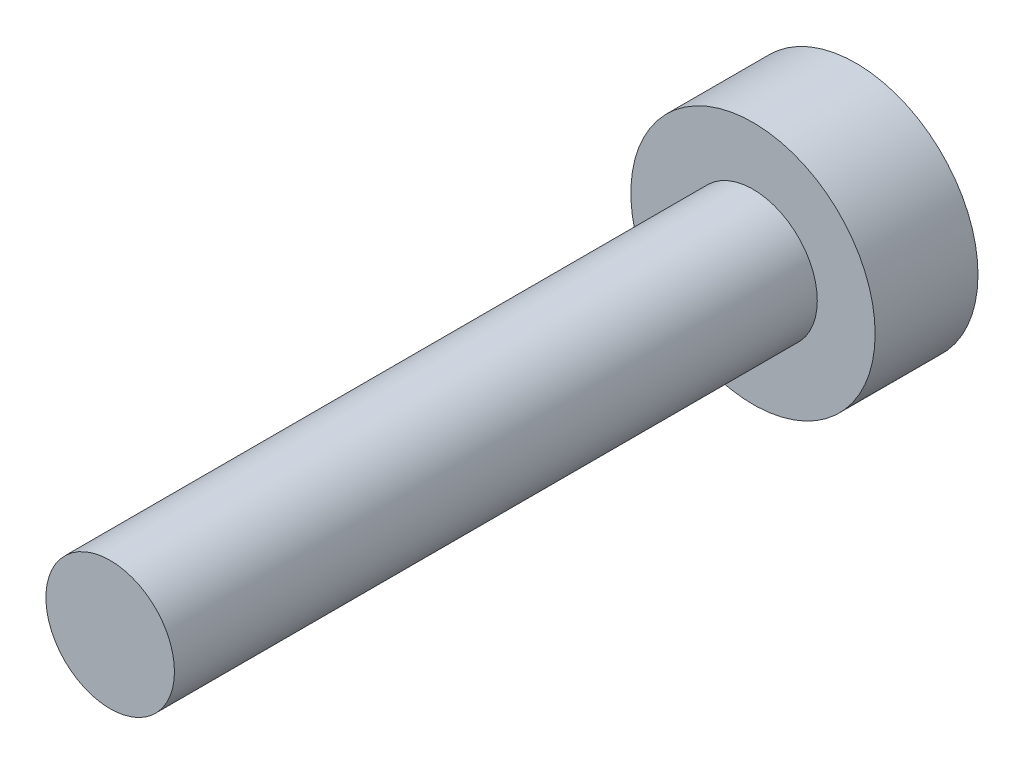
ISO-10303-21;
HEADER;
FILE_DESCRIPTION(('STEP AP214'),'2;1');
FILE_NAME('part.step','',(''),(''),'','','');
FILE_SCHEMA(('AUTOMOTIVE_DESIGN { 1 0 10303 214 1 1 1 1 }'));
ENDSEC;
DATA;
#1=APPLICATION_CONTEXT('core data for automotive mechanical design processes');
#2=APPLICATION_PROTOCOL_DEFINITION('international standard','automotive_design',2000,#1);
#3=PRODUCT_CONTEXT('',#1,'mechanical');
#4=PRODUCT('Part','Part','',(#3));
#5=PRODUCT_RELATED_PRODUCT_CATEGORY('part','',(#4));
#6=PRODUCT_DEFINITION_FORMATION('','',#4);
#7=PRODUCT_DEFINITION_CONTEXT('part definition',#1,'design');
#8=PRODUCT_DEFINITION('design','',#6,#7);
#9=PRODUCT_DEFINITION_SHAPE('','',#8);
#10=(LENGTH_UNIT() NAMED_UNIT(*) SI_UNIT(.MILLI.,.METRE.));
#11=(NAMED_UNIT(*) PLANE_ANGLE_UNIT() SI_UNIT($,.RADIAN.));
#12=(NAMED_UNIT(*) SI_UNIT($,.STERADIAN.) SOLID_ANGLE_UNIT());
#13=UNCERTAINTY_MEASURE_WITH_UNIT(LENGTH_MEASURE(1.E-05),#10,'distance_accuracy_value','');
#14=(GEOMETRIC_REPRESENTATION_CONTEXT(3) GLOBAL_UNCERTAINTY_ASSIGNED_CONTEXT((#13)) GLOBAL_UNIT_ASSIGNED_CONTEXT((#10,
#11,#12)) REPRESENTATION_CONTEXT('',''));
#15=CARTESIAN_POINT('',(0.,0.,0.));
#16=DIRECTION('',(0.,0.,1.));
#17=DIRECTION('',(1.,0.,0.));
#18=AXIS2_PLACEMENT_3D('',#15,#16,#17);
#19=CARTESIAN_POINT('',(0.,0.,10.));
#20=DIRECTION('',(0.,0.,-1.));
#21=DIRECTION('',(-1.,0.,0.));
#22=AXIS2_PLACEMENT_3D('',#19,#20,#21);
#23=CYLINDRICAL_SURFACE('',#22,1.);
#24=CARTESIAN_POINT('',(0.,0.,10.));
#25=DIRECTION('',(0.,0.,1.));
#26=DIRECTION('',(1.,0.,0.));
#27=AXIS2_PLACEMENT_3D('',#24,#25,#26);
#28=CIRCLE('',#27,1.);
#29=CARTESIAN_POINT('',(1.,0.,10.));
#30=VERTEX_POINT('',#29);
#31=EDGE_CURVE('E10',#30,#30,#28,.T.);
#32=ORIENTED_EDGE('',*,*,#31,.F.);
#33=EDGE_LOOP('',(#32));
#34=FACE_BOUND('',#33,.T.);
#35=CARTESIAN_POINT('',(0.,0.,0.));
#36=DIRECTION('',(0.,0.,1.));
#37=DIRECTION('',(1.,0.,0.));
#38=AXIS2_PLACEMENT_3D('',#35,#36,#37);
#39=CIRCLE('',#38,1.);
#40=CARTESIAN_POINT('',(1.,0.,0.));
#41=VERTEX_POINT('',#40);
#42=EDGE_CURVE('E36',#41,#41,#39,.T.);
#43=ORIENTED_EDGE('',*,*,#42,.T.);
#44=EDGE_LOOP('',(#43));
#45=FACE_BOUND('',#44,.T.);
#46=ADVANCED_FACE('F33',(#34,#45),#23,.T.);
#47=CARTESIAN_POINT('',(0.,0.,10.));
#48=DIRECTION('',(0.,0.,1.));
#49=DIRECTION('',(1.,0.,0.));
#50=AXIS2_PLACEMENT_3D('',#47,#48,#49);
#51=PLANE('',#50);
#52=ORIENTED_EDGE('',*,*,#31,.T.);
#53=EDGE_LOOP('',(#52));
#54=FACE_BOUND('',#53,.T.);
#55=ADVANCED_FACE('F56',(#54),#51,.T.);
#56=CARTESIAN_POINT('',(0.,0.,0.));
#57=DIRECTION('',(0.,0.,-1.));
#58=DIRECTION('',(-1.,0.,0.));
#59=AXIS2_PLACEMENT_3D('',#56,#57,#58);
#60=CYLINDRICAL_SURFACE('',#59,1.9);
#61=CARTESIAN_POINT('',(0.,0.,0.));
#62=DIRECTION('',(0.,0.,1.));
#63=DIRECTION('',(1.,0.,0.));
#64=AXIS2_PLACEMENT_3D('',#61,#62,#63);
#65=CIRCLE('',#64,1.9);
#66=CARTESIAN_POINT('',(1.9,0.,0.));
#67=VERTEX_POINT('',#66);
#68=EDGE_CURVE('E43',#67,#67,#65,.T.);
#69=ORIENTED_EDGE('',*,*,#68,.F.);
#70=EDGE_LOOP('',(#69));
#71=FACE_BOUND('',#70,.T.);
#72=CARTESIAN_POINT('',(0.,0.,-1.6));
#73=DIRECTION('',(0.,0.,1.));
#74=DIRECTION('',(1.,0.,0.));
#75=AXIS2_PLACEMENT_3D('',#72,#73,#74);
#76=CIRCLE('',#75,1.9);
#77=CARTESIAN_POINT('',(1.9,0.,-1.6));
#78=VERTEX_POINT('',#77);
#79=EDGE_CURVE('E45',#78,#78,#76,.T.);
#80=ORIENTED_EDGE('',*,*,#79,.T.);
#81=EDGE_LOOP('',(#80));
#82=FACE_BOUND('',#81,.T.);
#83=ADVANCED_FACE('F53',(#71,#82),#60,.T.);
#84=CARTESIAN_POINT('',(0.,0.,0.));
#85=DIRECTION('',(0.,0.,1.));
#86=DIRECTION('',(1.,0.,0.));
#87=AXIS2_PLACEMENT_3D('',#84,#85,#86);
#88=PLANE('',#87);
#89=ORIENTED_EDGE('',*,*,#42,.F.);
#90=EDGE_LOOP('',(#89));
#91=FACE_BOUND('',#90,.T.);
#92=ORIENTED_EDGE('',*,*,#68,.T.);
#93=EDGE_LOOP('',(#92));
#94=FACE_BOUND('',#93,.T.);
#95=ADVANCED_FACE('F51',(#91,#94),#88,.T.);
#96=CARTESIAN_POINT('',(0.,0.,-1.6));
#97=DIRECTION('',(0.,0.,1.));
#98=DIRECTION('',(1.,0.,0.));
#99=AXIS2_PLACEMENT_3D('',#96,#97,#98);
#100=PLANE('',#99);
#101=ORIENTED_EDGE('',*,*,#79,.F.);
#102=EDGE_LOOP('',(#101));
#103=FACE_BOUND('',#102,.T.);
#104=ADVANCED_FACE('F60',(#103),#100,.F.);
#105=CLOSED_SHELL('',(#46,#55,#83,#95,#104));
#106=MANIFOLD_SOLID_BREP('B2',#105);
#107=ADVANCED_BREP_SHAPE_REPRESENTATION('',(#18,#106),#14);
#108=SHAPE_DEFINITION_REPRESENTATION(#9,#107);
ENDSEC;
END-ISO-10303-21;
